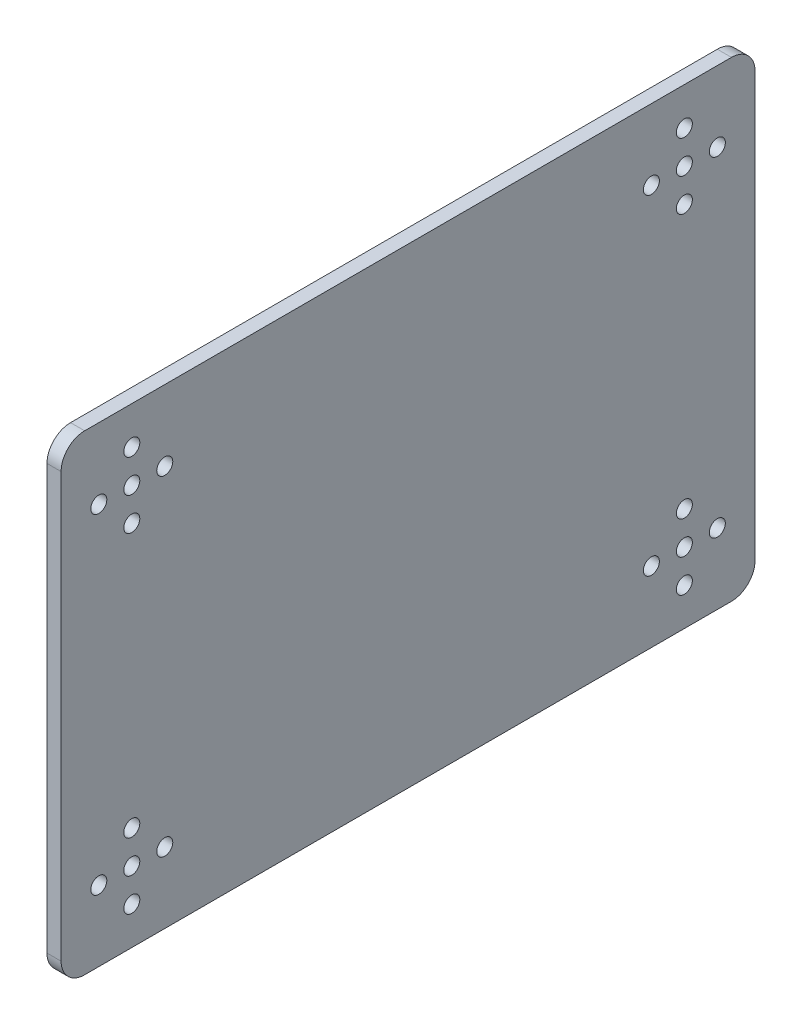
ISO-10303-21;
HEADER;
FILE_DESCRIPTION(('STEP AP214'),'2;1');
FILE_NAME('part.step','',(''),(''),'','','');
FILE_SCHEMA(('AUTOMOTIVE_DESIGN { 1 0 10303 214 1 1 1 1 }'));
ENDSEC;
DATA;
#1=APPLICATION_CONTEXT('core data for automotive mechanical design processes');
#2=APPLICATION_PROTOCOL_DEFINITION('international standard','automotive_design',2000,#1);
#3=PRODUCT_CONTEXT('',#1,'mechanical');
#4=PRODUCT('Part','Part','',(#3));
#5=PRODUCT_RELATED_PRODUCT_CATEGORY('part','',(#4));
#6=PRODUCT_DEFINITION_FORMATION('','',#4);
#7=PRODUCT_DEFINITION_CONTEXT('part definition',#1,'design');
#8=PRODUCT_DEFINITION('design','',#6,#7);
#9=PRODUCT_DEFINITION_SHAPE('','',#8);
#10=(LENGTH_UNIT() NAMED_UNIT(*) SI_UNIT(.MILLI.,.METRE.));
#11=(NAMED_UNIT(*) PLANE_ANGLE_UNIT() SI_UNIT($,.RADIAN.));
#12=(NAMED_UNIT(*) SI_UNIT($,.STERADIAN.) SOLID_ANGLE_UNIT());
#13=UNCERTAINTY_MEASURE_WITH_UNIT(LENGTH_MEASURE(1.E-05),#10,'distance_accuracy_value','');
#14=(GEOMETRIC_REPRESENTATION_CONTEXT(3) GLOBAL_UNCERTAINTY_ASSIGNED_CONTEXT((#13)) GLOBAL_UNIT_ASSIGNED_CONTEXT((#10,
#11,#12)) REPRESENTATION_CONTEXT('',''));
#15=CARTESIAN_POINT('',(0.,0.,0.));
#16=DIRECTION('',(0.,0.,1.));
#17=DIRECTION('',(1.,0.,0.));
#18=AXIS2_PLACEMENT_3D('',#15,#16,#17);
#19=CARTESIAN_POINT('',(3.,0.,0.));
#20=DIRECTION('',(-1.,0.,0.));
#21=DIRECTION('',(0.,0.,1.));
#22=AXIS2_PLACEMENT_3D('',#19,#20,#21);
#23=PLANE('',#22);
#24=CARTESIAN_POINT('',(3.,35.,58.645));
#25=DIRECTION('',(-1.,0.,0.));
#26=DIRECTION('',(0.,0.,1.));
#27=AXIS2_PLACEMENT_3D('',#24,#25,#26);
#28=CIRCLE('',#27,1.69999999999999);
#29=CARTESIAN_POINT('',(3.,35.,60.345));
#30=VERTEX_POINT('',#29);
#31=EDGE_CURVE('E288',#30,#30,#28,.T.);
#32=ORIENTED_EDGE('',*,*,#31,.T.);
#33=EDGE_LOOP('',(#32));
#34=FACE_BOUND('',#33,.T.);
#35=CARTESIAN_POINT('',(3.,42.,58.645));
#36=DIRECTION('',(-1.,0.,0.));
#37=DIRECTION('',(0.,0.,1.));
#38=AXIS2_PLACEMENT_3D('',#35,#36,#37);
#39=CIRCLE('',#38,1.69999999999999);
#40=CARTESIAN_POINT('',(3.,42.,60.345));
#41=VERTEX_POINT('',#40);
#42=EDGE_CURVE('E282',#41,#41,#39,.T.);
#43=ORIENTED_EDGE('',*,*,#42,.T.);
#44=EDGE_LOOP('',(#43));
#45=FACE_BOUND('',#44,.T.);
#46=CARTESIAN_POINT('',(3.,35.,65.645));
#47=DIRECTION('',(-1.,0.,0.));
#48=DIRECTION('',(0.,0.,1.));
#49=AXIS2_PLACEMENT_3D('',#46,#47,#48);
#50=CIRCLE('',#49,1.69999999999999);
#51=CARTESIAN_POINT('',(3.,35.,67.345));
#52=VERTEX_POINT('',#51);
#53=EDGE_CURVE('E276',#52,#52,#50,.T.);
#54=ORIENTED_EDGE('',*,*,#53,.T.);
#55=EDGE_LOOP('',(#54));
#56=FACE_BOUND('',#55,.T.);
#57=CARTESIAN_POINT('',(3.,28.,58.645));
#58=DIRECTION('',(-1.,0.,0.));
#59=DIRECTION('',(0.,0.,1.));
#60=AXIS2_PLACEMENT_3D('',#57,#58,#59);
#61=CIRCLE('',#60,1.69999999999999);
#62=CARTESIAN_POINT('',(3.,28.,60.345));
#63=VERTEX_POINT('',#62);
#64=EDGE_CURVE('E270',#63,#63,#61,.T.);
#65=ORIENTED_EDGE('',*,*,#64,.T.);
#66=EDGE_LOOP('',(#65));
#67=FACE_BOUND('',#66,.T.);
#68=CARTESIAN_POINT('',(3.,35.,51.645));
#69=DIRECTION('',(-1.,0.,0.));
#70=DIRECTION('',(0.,0.,1.));
#71=AXIS2_PLACEMENT_3D('',#68,#69,#70);
#72=CIRCLE('',#71,1.69999999999999);
#73=CARTESIAN_POINT('',(3.,35.,53.345));
#74=VERTEX_POINT('',#73);
#75=EDGE_CURVE('E264',#74,#74,#72,.T.);
#76=ORIENTED_EDGE('',*,*,#75,.T.);
#77=EDGE_LOOP('',(#76));
#78=FACE_BOUND('',#77,.T.);
#79=CARTESIAN_POINT('',(3.,-35.,58.645));
#80=DIRECTION('',(-1.,0.,0.));
#81=DIRECTION('',(0.,0.,1.));
#82=AXIS2_PLACEMENT_3D('',#79,#80,#81);
#83=CIRCLE('',#82,1.69999999999999);
#84=CARTESIAN_POINT('',(3.,-35.,60.345));
#85=VERTEX_POINT('',#84);
#86=EDGE_CURVE('E258',#85,#85,#83,.T.);
#87=ORIENTED_EDGE('',*,*,#86,.T.);
#88=EDGE_LOOP('',(#87));
#89=FACE_BOUND('',#88,.T.);
#90=CARTESIAN_POINT('',(3.,-28.,58.645));
#91=DIRECTION('',(-1.,0.,0.));
#92=DIRECTION('',(0.,0.,1.));
#93=AXIS2_PLACEMENT_3D('',#90,#91,#92);
#94=CIRCLE('',#93,1.69999999999999);
#95=CARTESIAN_POINT('',(3.,-28.,60.345));
#96=VERTEX_POINT('',#95);
#97=EDGE_CURVE('E252',#96,#96,#94,.T.);
#98=ORIENTED_EDGE('',*,*,#97,.T.);
#99=EDGE_LOOP('',(#98));
#100=FACE_BOUND('',#99,.T.);
#101=CARTESIAN_POINT('',(3.,-35.,65.645));
#102=DIRECTION('',(-1.,0.,0.));
#103=DIRECTION('',(0.,0.,1.));
#104=AXIS2_PLACEMENT_3D('',#101,#102,#103);
#105=CIRCLE('',#104,1.69999999999999);
#106=CARTESIAN_POINT('',(3.,-35.,67.345));
#107=VERTEX_POINT('',#106);
#108=EDGE_CURVE('E246',#107,#107,#105,.T.);
#109=ORIENTED_EDGE('',*,*,#108,.T.);
#110=EDGE_LOOP('',(#109));
#111=FACE_BOUND('',#110,.T.);
#112=CARTESIAN_POINT('',(3.,-42.,58.645));
#113=DIRECTION('',(-1.,0.,0.));
#114=DIRECTION('',(0.,0.,1.));
#115=AXIS2_PLACEMENT_3D('',#112,#113,#114);
#116=CIRCLE('',#115,1.69999999999999);
#117=CARTESIAN_POINT('',(3.,-42.,60.345));
#118=VERTEX_POINT('',#117);
#119=EDGE_CURVE('E240',#118,#118,#116,.T.);
#120=ORIENTED_EDGE('',*,*,#119,.T.);
#121=EDGE_LOOP('',(#120));
#122=FACE_BOUND('',#121,.T.);
#123=CARTESIAN_POINT('',(3.,-35.,51.645));
#124=DIRECTION('',(-1.,0.,0.));
#125=DIRECTION('',(0.,0.,1.));
#126=AXIS2_PLACEMENT_3D('',#123,#124,#125);
#127=CIRCLE('',#126,1.69999999999999);
#128=CARTESIAN_POINT('',(3.,-35.,53.345));
#129=VERTEX_POINT('',#128);
#130=EDGE_CURVE('E234',#129,#129,#127,.T.);
#131=ORIENTED_EDGE('',*,*,#130,.T.);
#132=EDGE_LOOP('',(#131));
#133=FACE_BOUND('',#132,.T.);
#134=CARTESIAN_POINT('',(3.,-35.,-58.645));
#135=DIRECTION('',(1.,0.,0.));
#136=DIRECTION('',(0.,0.,-1.));
#137=AXIS2_PLACEMENT_3D('',#134,#135,#136);
#138=CIRCLE('',#137,1.69999999999999);
#139=CARTESIAN_POINT('',(3.,-35.,-60.345));
#140=VERTEX_POINT('',#139);
#141=EDGE_CURVE('E231',#140,#140,#138,.T.);
#142=ORIENTED_EDGE('',*,*,#141,.F.);
#143=EDGE_LOOP('',(#142));
#144=FACE_BOUND('',#143,.T.);
#145=CARTESIAN_POINT('',(3.,-28.,-58.645));
#146=DIRECTION('',(1.,0.,0.));
#147=DIRECTION('',(0.,0.,-1.));
#148=AXIS2_PLACEMENT_3D('',#145,#146,#147);
#149=CIRCLE('',#148,1.69999999999999);
#150=CARTESIAN_POINT('',(3.,-28.,-60.345));
#151=VERTEX_POINT('',#150);
#152=EDGE_CURVE('E219',#151,#151,#149,.T.);
#153=ORIENTED_EDGE('',*,*,#152,.F.);
#154=EDGE_LOOP('',(#153));
#155=FACE_BOUND('',#154,.T.);
#156=CARTESIAN_POINT('',(3.,-35.,-65.645));
#157=DIRECTION('',(1.,0.,0.));
#158=DIRECTION('',(0.,0.,-1.));
#159=AXIS2_PLACEMENT_3D('',#156,#157,#158);
#160=CIRCLE('',#159,1.69999999999999);
#161=CARTESIAN_POINT('',(3.,-35.,-67.345));
#162=VERTEX_POINT('',#161);
#163=EDGE_CURVE('E213',#162,#162,#160,.T.);
#164=ORIENTED_EDGE('',*,*,#163,.F.);
#165=EDGE_LOOP('',(#164));
#166=FACE_BOUND('',#165,.T.);
#167=CARTESIAN_POINT('',(3.,35.,-58.645));
#168=DIRECTION('',(1.,0.,0.));
#169=DIRECTION('',(0.,0.,-1.));
#170=AXIS2_PLACEMENT_3D('',#167,#168,#169);
#171=CIRCLE('',#170,1.69999999999999);
#172=CARTESIAN_POINT('',(3.,35.,-60.345));
#173=VERTEX_POINT('',#172);
#174=EDGE_CURVE('E201',#173,#173,#171,.T.);
#175=ORIENTED_EDGE('',*,*,#174,.F.);
#176=EDGE_LOOP('',(#175));
#177=FACE_BOUND('',#176,.T.);
#178=CARTESIAN_POINT('',(3.,28.,-58.645));
#179=DIRECTION('',(1.,0.,0.));
#180=DIRECTION('',(0.,0.,-1.));
#181=AXIS2_PLACEMENT_3D('',#178,#179,#180);
#182=CIRCLE('',#181,1.69999999999999);
#183=CARTESIAN_POINT('',(3.,28.,-60.345));
#184=VERTEX_POINT('',#183);
#185=EDGE_CURVE('E183',#184,#184,#182,.T.);
#186=ORIENTED_EDGE('',*,*,#185,.F.);
#187=EDGE_LOOP('',(#186));
#188=FACE_BOUND('',#187,.T.);
#189=DIRECTION('',(0.,0.,1.));
#190=VECTOR('',#189,1.);
#191=CARTESIAN_POINT('',(3.,50.,73.645));
#192=LINE('',#191,#190);
#193=CARTESIAN_POINT('',(3.,50.,-68.645));
#194=VERTEX_POINT('',#193);
#195=CARTESIAN_POINT('',(3.,50.,68.645));
#196=VERTEX_POINT('',#195);
#197=EDGE_CURVE('E174',#194,#196,#192,.T.);
#198=ORIENTED_EDGE('',*,*,#197,.T.);
#199=CARTESIAN_POINT('',(3.,45.,68.645));
#200=DIRECTION('',(-1.,0.,0.));
#201=DIRECTION('',(0.,0.,1.));
#202=AXIS2_PLACEMENT_3D('',#199,#200,#201);
#203=CIRCLE('',#202,5.);
#204=CARTESIAN_POINT('',(3.,45.,73.645));
#205=VERTEX_POINT('',#204);
#206=EDGE_CURVE('E151',#196,#205,#203,.F.);
#207=ORIENTED_EDGE('',*,*,#206,.T.);
#208=DIRECTION('',(0.,-1.,0.));
#209=VECTOR('',#208,1.);
#210=CARTESIAN_POINT('',(3.,-50.,73.645));
#211=LINE('',#210,#209);
#212=CARTESIAN_POINT('',(3.,-45.,73.645));
#213=VERTEX_POINT('',#212);
#214=EDGE_CURVE('E122',#205,#213,#211,.T.);
#215=ORIENTED_EDGE('',*,*,#214,.T.);
#216=CARTESIAN_POINT('',(3.,-45.,68.645));
#217=DIRECTION('',(-1.,0.,0.));
#218=DIRECTION('',(0.,0.,1.));
#219=AXIS2_PLACEMENT_3D('',#216,#217,#218);
#220=CIRCLE('',#219,5.);
#221=CARTESIAN_POINT('',(3.,-50.,68.645));
#222=VERTEX_POINT('',#221);
#223=EDGE_CURVE('E59',#213,#222,#220,.F.);
#224=ORIENTED_EDGE('',*,*,#223,.T.);
#225=DIRECTION('',(0.,0.,-1.));
#226=VECTOR('',#225,1.);
#227=CARTESIAN_POINT('',(3.,-50.,73.645));
#228=LINE('',#227,#226);
#229=CARTESIAN_POINT('',(3.,-50.,-68.645));
#230=VERTEX_POINT('',#229);
#231=EDGE_CURVE('E137',#222,#230,#228,.T.);
#232=ORIENTED_EDGE('',*,*,#231,.T.);
#233=CARTESIAN_POINT('',(3.,-45.,-68.645));
#234=DIRECTION('',(-1.,0.,0.));
#235=DIRECTION('',(0.,0.,1.));
#236=AXIS2_PLACEMENT_3D('',#233,#234,#235);
#237=CIRCLE('',#236,5.);
#238=CARTESIAN_POINT('',(3.,-45.,-73.645));
#239=VERTEX_POINT('',#238);
#240=EDGE_CURVE('E146',#230,#239,#237,.F.);
#241=ORIENTED_EDGE('',*,*,#240,.T.);
#242=DIRECTION('',(0.,1.,0.));
#243=VECTOR('',#242,1.);
#244=CARTESIAN_POINT('',(3.,-50.,-73.645));
#245=LINE('',#244,#243);
#246=CARTESIAN_POINT('',(3.,45.,-73.645));
#247=VERTEX_POINT('',#246);
#248=EDGE_CURVE('E131',#239,#247,#245,.T.);
#249=ORIENTED_EDGE('',*,*,#248,.T.);
#250=CARTESIAN_POINT('',(3.,45.,-68.645));
#251=DIRECTION('',(-1.,0.,0.));
#252=DIRECTION('',(0.,0.,1.));
#253=AXIS2_PLACEMENT_3D('',#250,#251,#252);
#254=CIRCLE('',#253,5.);
#255=EDGE_CURVE('E148',#247,#194,#254,.F.);
#256=ORIENTED_EDGE('',*,*,#255,.T.);
#257=EDGE_LOOP('',(#198,#207,#215,#224,#232,#241,#249,#256));
#258=FACE_BOUND('',#257,.T.);
#259=CARTESIAN_POINT('',(3.,35.,-65.645));
#260=DIRECTION('',(1.,0.,0.));
#261=DIRECTION('',(0.,0.,-1.));
#262=AXIS2_PLACEMENT_3D('',#259,#260,#261);
#263=CIRCLE('',#262,1.69999999999999);
#264=CARTESIAN_POINT('',(3.,35.,-67.345));
#265=VERTEX_POINT('',#264);
#266=EDGE_CURVE('E169',#265,#265,#263,.T.);
#267=ORIENTED_EDGE('',*,*,#266,.F.);
#268=EDGE_LOOP('',(#267));
#269=FACE_BOUND('',#268,.T.);
#270=CARTESIAN_POINT('',(3.,35.,-51.645));
#271=DIRECTION('',(1.,0.,0.));
#272=DIRECTION('',(0.,0.,-1.));
#273=AXIS2_PLACEMENT_3D('',#270,#271,#272);
#274=CIRCLE('',#273,1.69999999999999);
#275=CARTESIAN_POINT('',(3.,35.,-53.345));
#276=VERTEX_POINT('',#275);
#277=EDGE_CURVE('E189',#276,#276,#274,.T.);
#278=ORIENTED_EDGE('',*,*,#277,.F.);
#279=EDGE_LOOP('',(#278));
#280=FACE_BOUND('',#279,.T.);
#281=CARTESIAN_POINT('',(3.,42.,-58.645));
#282=DIRECTION('',(1.,0.,0.));
#283=DIRECTION('',(0.,0.,-1.));
#284=AXIS2_PLACEMENT_3D('',#281,#282,#283);
#285=CIRCLE('',#284,1.69999999999999);
#286=CARTESIAN_POINT('',(3.,42.,-60.345));
#287=VERTEX_POINT('',#286);
#288=EDGE_CURVE('E195',#287,#287,#285,.T.);
#289=ORIENTED_EDGE('',*,*,#288,.F.);
#290=EDGE_LOOP('',(#289));
#291=FACE_BOUND('',#290,.T.);
#292=CARTESIAN_POINT('',(3.,-42.,-58.645));
#293=DIRECTION('',(1.,0.,0.));
#294=DIRECTION('',(0.,0.,-1.));
#295=AXIS2_PLACEMENT_3D('',#292,#293,#294);
#296=CIRCLE('',#295,1.69999999999999);
#297=CARTESIAN_POINT('',(3.,-42.,-60.345));
#298=VERTEX_POINT('',#297);
#299=EDGE_CURVE('E207',#298,#298,#296,.T.);
#300=ORIENTED_EDGE('',*,*,#299,.F.);
#301=EDGE_LOOP('',(#300));
#302=FACE_BOUND('',#301,.T.);
#303=CARTESIAN_POINT('',(3.,-35.,-51.645));
#304=DIRECTION('',(1.,0.,0.));
#305=DIRECTION('',(0.,0.,-1.));
#306=AXIS2_PLACEMENT_3D('',#303,#304,#305);
#307=CIRCLE('',#306,1.69999999999999);
#308=CARTESIAN_POINT('',(3.,-35.,-53.345));
#309=VERTEX_POINT('',#308);
#310=EDGE_CURVE('E225',#309,#309,#307,.T.);
#311=ORIENTED_EDGE('',*,*,#310,.F.);
#312=EDGE_LOOP('',(#311));
#313=FACE_BOUND('',#312,.T.);
#314=ADVANCED_FACE('F37',(#34,#45,#56,#67,#78,#89,#100,#111,#122,#133,#144,#155,#166,#177,#188,
#258,#269,#280,#291,#302,#313),#23,.F.);
#315=CARTESIAN_POINT('',(3.,-50.,-73.645));
#316=DIRECTION('',(0.,0.,1.));
#317=DIRECTION('',(1.,0.,0.));
#318=AXIS2_PLACEMENT_3D('',#315,#316,#317);
#319=PLANE('',#318);
#320=DIRECTION('',(0.,1.,0.));
#321=VECTOR('',#320,1.);
#322=CARTESIAN_POINT('',(0.,-50.,-73.645));
#323=LINE('',#322,#321);
#324=CARTESIAN_POINT('',(0.,-45.,-73.645));
#325=VERTEX_POINT('',#324);
#326=CARTESIAN_POINT('',(0.,45.,-73.645));
#327=VERTEX_POINT('',#326);
#328=EDGE_CURVE('E133',#325,#327,#323,.T.);
#329=ORIENTED_EDGE('',*,*,#328,.T.);
#330=DIRECTION('',(-1.,0.,0.));
#331=VECTOR('',#330,1.);
#332=CARTESIAN_POINT('',(3.,45.,-73.645));
#333=LINE('',#332,#331);
#334=EDGE_CURVE('E11',#327,#247,#333,.F.);
#335=ORIENTED_EDGE('',*,*,#334,.T.);
#336=ORIENTED_EDGE('',*,*,#248,.F.);
#337=DIRECTION('',(-1.,0.,0.));
#338=VECTOR('',#337,1.);
#339=CARTESIAN_POINT('',(3.,-45.,-73.645));
#340=LINE('',#339,#338);
#341=EDGE_CURVE('E45',#239,#325,#340,.T.);
#342=ORIENTED_EDGE('',*,*,#341,.T.);
#343=EDGE_LOOP('',(#329,#335,#336,#342));
#344=FACE_BOUND('',#343,.T.);
#345=ADVANCED_FACE('F162',(#344),#319,.F.);
#346=CARTESIAN_POINT('',(3.,50.,73.645));
#347=DIRECTION('',(0.,-1.,0.));
#348=DIRECTION('',(0.,0.,-1.));
#349=AXIS2_PLACEMENT_3D('',#346,#347,#348);
#350=PLANE('',#349);
#351=DIRECTION('',(0.,0.,1.));
#352=VECTOR('',#351,1.);
#353=CARTESIAN_POINT('',(0.,50.,73.645));
#354=LINE('',#353,#352);
#355=CARTESIAN_POINT('',(0.,50.,-68.645));
#356=VERTEX_POINT('',#355);
#357=CARTESIAN_POINT('',(0.,50.,68.645));
#358=VERTEX_POINT('',#357);
#359=EDGE_CURVE('E129',#356,#358,#354,.T.);
#360=ORIENTED_EDGE('',*,*,#359,.T.);
#361=DIRECTION('',(-1.,0.,0.));
#362=VECTOR('',#361,1.);
#363=CARTESIAN_POINT('',(3.,50.,68.645));
#364=LINE('',#363,#362);
#365=EDGE_CURVE('E108',#358,#196,#364,.F.);
#366=ORIENTED_EDGE('',*,*,#365,.T.);
#367=ORIENTED_EDGE('',*,*,#197,.F.);
#368=DIRECTION('',(-1.,0.,0.));
#369=VECTOR('',#368,1.);
#370=CARTESIAN_POINT('',(3.,50.,-68.645));
#371=LINE('',#370,#369);
#372=EDGE_CURVE('E113',#194,#356,#371,.T.);
#373=ORIENTED_EDGE('',*,*,#372,.T.);
#374=EDGE_LOOP('',(#360,#366,#367,#373));
#375=FACE_BOUND('',#374,.T.);
#376=ADVANCED_FACE('F358',(#375),#350,.F.);
#377=CARTESIAN_POINT('',(3.,-50.,73.645));
#378=DIRECTION('',(0.,0.,-1.));
#379=DIRECTION('',(-1.,0.,0.));
#380=AXIS2_PLACEMENT_3D('',#377,#378,#379);
#381=PLANE('',#380);
#382=ORIENTED_EDGE('',*,*,#214,.F.);
#383=DIRECTION('',(-1.,0.,0.));
#384=VECTOR('',#383,1.);
#385=CARTESIAN_POINT('',(3.,45.,73.645));
#386=LINE('',#385,#384);
#387=CARTESIAN_POINT('',(0.,45.,73.645));
#388=VERTEX_POINT('',#387);
#389=EDGE_CURVE('E107',#205,#388,#386,.T.);
#390=ORIENTED_EDGE('',*,*,#389,.T.);
#391=DIRECTION('',(0.,-1.,0.));
#392=VECTOR('',#391,1.);
#393=CARTESIAN_POINT('',(0.,-50.,73.645));
#394=LINE('',#393,#392);
#395=CARTESIAN_POINT('',(0.,-45.,73.645));
#396=VERTEX_POINT('',#395);
#397=EDGE_CURVE('E120',#388,#396,#394,.T.);
#398=ORIENTED_EDGE('',*,*,#397,.T.);
#399=DIRECTION('',(-1.,0.,0.));
#400=VECTOR('',#399,1.);
#401=CARTESIAN_POINT('',(3.,-45.,73.645));
#402=LINE('',#401,#400);
#403=EDGE_CURVE('E124',#396,#213,#402,.F.);
#404=ORIENTED_EDGE('',*,*,#403,.T.);
#405=EDGE_LOOP('',(#382,#390,#398,#404));
#406=FACE_BOUND('',#405,.T.);
#407=ADVANCED_FACE('F119',(#406),#381,.F.);
#408=CARTESIAN_POINT('',(3.,-50.,73.645));
#409=DIRECTION('',(0.,1.,0.));
#410=DIRECTION('',(0.,0.,1.));
#411=AXIS2_PLACEMENT_3D('',#408,#409,#410);
#412=PLANE('',#411);
#413=ORIENTED_EDGE('',*,*,#231,.F.);
#414=DIRECTION('',(-1.,0.,0.));
#415=VECTOR('',#414,1.);
#416=CARTESIAN_POINT('',(3.,-50.,68.645));
#417=LINE('',#416,#415);
#418=CARTESIAN_POINT('',(0.,-50.,68.645));
#419=VERTEX_POINT('',#418);
#420=EDGE_CURVE('E154',#222,#419,#417,.T.);
#421=ORIENTED_EDGE('',*,*,#420,.T.);
#422=DIRECTION('',(0.,0.,-1.));
#423=VECTOR('',#422,1.);
#424=CARTESIAN_POINT('',(0.,-50.,73.645));
#425=LINE('',#424,#423);
#426=CARTESIAN_POINT('',(0.,-50.,-68.645));
#427=VERTEX_POINT('',#426);
#428=EDGE_CURVE('E128',#419,#427,#425,.T.);
#429=ORIENTED_EDGE('',*,*,#428,.T.);
#430=DIRECTION('',(-1.,0.,0.));
#431=VECTOR('',#430,1.);
#432=CARTESIAN_POINT('',(3.,-50.,-68.645));
#433=LINE('',#432,#431);
#434=EDGE_CURVE('E52',#427,#230,#433,.F.);
#435=ORIENTED_EDGE('',*,*,#434,.T.);
#436=EDGE_LOOP('',(#413,#421,#429,#435));
#437=FACE_BOUND('',#436,.T.);
#438=ADVANCED_FACE('F300',(#437),#412,.F.);
#439=CARTESIAN_POINT('',(0.,0.,0.));
#440=DIRECTION('',(-1.,0.,0.));
#441=DIRECTION('',(0.,0.,1.));
#442=AXIS2_PLACEMENT_3D('',#439,#440,#441);
#443=PLANE('',#442);
#444=CARTESIAN_POINT('',(0.,35.,58.645));
#445=DIRECTION('',(-1.,0.,0.));
#446=DIRECTION('',(0.,0.,1.));
#447=AXIS2_PLACEMENT_3D('',#444,#445,#446);
#448=CIRCLE('',#447,1.69999999999999);
#449=CARTESIAN_POINT('',(0.,35.,60.345));
#450=VERTEX_POINT('',#449);
#451=EDGE_CURVE('E291',#450,#450,#448,.T.);
#452=ORIENTED_EDGE('',*,*,#451,.F.);
#453=EDGE_LOOP('',(#452));
#454=FACE_BOUND('',#453,.T.);
#455=CARTESIAN_POINT('',(0.,42.,58.645));
#456=DIRECTION('',(-1.,0.,0.));
#457=DIRECTION('',(0.,0.,1.));
#458=AXIS2_PLACEMENT_3D('',#455,#456,#457);
#459=CIRCLE('',#458,1.69999999999999);
#460=CARTESIAN_POINT('',(0.,42.,60.345));
#461=VERTEX_POINT('',#460);
#462=EDGE_CURVE('E285',#461,#461,#459,.T.);
#463=ORIENTED_EDGE('',*,*,#462,.F.);
#464=EDGE_LOOP('',(#463));
#465=FACE_BOUND('',#464,.T.);
#466=CARTESIAN_POINT('',(0.,35.,65.645));
#467=DIRECTION('',(-1.,0.,0.));
#468=DIRECTION('',(0.,0.,1.));
#469=AXIS2_PLACEMENT_3D('',#466,#467,#468);
#470=CIRCLE('',#469,1.69999999999999);
#471=CARTESIAN_POINT('',(0.,35.,67.345));
#472=VERTEX_POINT('',#471);
#473=EDGE_CURVE('E279',#472,#472,#470,.T.);
#474=ORIENTED_EDGE('',*,*,#473,.F.);
#475=EDGE_LOOP('',(#474));
#476=FACE_BOUND('',#475,.T.);
#477=CARTESIAN_POINT('',(0.,28.,58.645));
#478=DIRECTION('',(-1.,0.,0.));
#479=DIRECTION('',(0.,0.,1.));
#480=AXIS2_PLACEMENT_3D('',#477,#478,#479);
#481=CIRCLE('',#480,1.69999999999999);
#482=CARTESIAN_POINT('',(0.,28.,60.345));
#483=VERTEX_POINT('',#482);
#484=EDGE_CURVE('E273',#483,#483,#481,.T.);
#485=ORIENTED_EDGE('',*,*,#484,.F.);
#486=EDGE_LOOP('',(#485));
#487=FACE_BOUND('',#486,.T.);
#488=CARTESIAN_POINT('',(0.,35.,51.645));
#489=DIRECTION('',(-1.,0.,0.));
#490=DIRECTION('',(0.,0.,1.));
#491=AXIS2_PLACEMENT_3D('',#488,#489,#490);
#492=CIRCLE('',#491,1.69999999999999);
#493=CARTESIAN_POINT('',(0.,35.,53.345));
#494=VERTEX_POINT('',#493);
#495=EDGE_CURVE('E267',#494,#494,#492,.T.);
#496=ORIENTED_EDGE('',*,*,#495,.F.);
#497=EDGE_LOOP('',(#496));
#498=FACE_BOUND('',#497,.T.);
#499=CARTESIAN_POINT('',(0.,-35.,58.645));
#500=DIRECTION('',(-1.,0.,0.));
#501=DIRECTION('',(0.,0.,1.));
#502=AXIS2_PLACEMENT_3D('',#499,#500,#501);
#503=CIRCLE('',#502,1.69999999999999);
#504=CARTESIAN_POINT('',(0.,-35.,60.345));
#505=VERTEX_POINT('',#504);
#506=EDGE_CURVE('E261',#505,#505,#503,.T.);
#507=ORIENTED_EDGE('',*,*,#506,.F.);
#508=EDGE_LOOP('',(#507));
#509=FACE_BOUND('',#508,.T.);
#510=CARTESIAN_POINT('',(0.,-28.,58.645));
#511=DIRECTION('',(-1.,0.,0.));
#512=DIRECTION('',(0.,0.,1.));
#513=AXIS2_PLACEMENT_3D('',#510,#511,#512);
#514=CIRCLE('',#513,1.69999999999999);
#515=CARTESIAN_POINT('',(0.,-28.,60.345));
#516=VERTEX_POINT('',#515);
#517=EDGE_CURVE('E255',#516,#516,#514,.T.);
#518=ORIENTED_EDGE('',*,*,#517,.F.);
#519=EDGE_LOOP('',(#518));
#520=FACE_BOUND('',#519,.T.);
#521=CARTESIAN_POINT('',(0.,-35.,65.645));
#522=DIRECTION('',(-1.,0.,0.));
#523=DIRECTION('',(0.,0.,1.));
#524=AXIS2_PLACEMENT_3D('',#521,#522,#523);
#525=CIRCLE('',#524,1.69999999999999);
#526=CARTESIAN_POINT('',(0.,-35.,67.345));
#527=VERTEX_POINT('',#526);
#528=EDGE_CURVE('E249',#527,#527,#525,.T.);
#529=ORIENTED_EDGE('',*,*,#528,.F.);
#530=EDGE_LOOP('',(#529));
#531=FACE_BOUND('',#530,.T.);
#532=CARTESIAN_POINT('',(0.,-42.,58.645));
#533=DIRECTION('',(-1.,0.,0.));
#534=DIRECTION('',(0.,0.,1.));
#535=AXIS2_PLACEMENT_3D('',#532,#533,#534);
#536=CIRCLE('',#535,1.69999999999999);
#537=CARTESIAN_POINT('',(0.,-42.,60.345));
#538=VERTEX_POINT('',#537);
#539=EDGE_CURVE('E243',#538,#538,#536,.T.);
#540=ORIENTED_EDGE('',*,*,#539,.F.);
#541=EDGE_LOOP('',(#540));
#542=FACE_BOUND('',#541,.T.);
#543=CARTESIAN_POINT('',(0.,-35.,51.645));
#544=DIRECTION('',(-1.,0.,0.));
#545=DIRECTION('',(0.,0.,1.));
#546=AXIS2_PLACEMENT_3D('',#543,#544,#545);
#547=CIRCLE('',#546,1.69999999999999);
#548=CARTESIAN_POINT('',(0.,-35.,53.345));
#549=VERTEX_POINT('',#548);
#550=EDGE_CURVE('E237',#549,#549,#547,.T.);
#551=ORIENTED_EDGE('',*,*,#550,.F.);
#552=EDGE_LOOP('',(#551));
#553=FACE_BOUND('',#552,.T.);
#554=CARTESIAN_POINT('',(0.,-35.,-58.645));
#555=DIRECTION('',(-1.,0.,0.));
#556=DIRECTION('',(0.,0.,1.));
#557=AXIS2_PLACEMENT_3D('',#554,#555,#556);
#558=CIRCLE('',#557,1.69999999999999);
#559=CARTESIAN_POINT('',(0.,-35.,-56.945));
#560=VERTEX_POINT('',#559);
#561=EDGE_CURVE('E228',#560,#560,#558,.T.);
#562=ORIENTED_EDGE('',*,*,#561,.F.);
#563=EDGE_LOOP('',(#562));
#564=FACE_BOUND('',#563,.T.);
#565=CARTESIAN_POINT('',(0.,-35.,-51.645));
#566=DIRECTION('',(-1.,0.,0.));
#567=DIRECTION('',(0.,0.,1.));
#568=AXIS2_PLACEMENT_3D('',#565,#566,#567);
#569=CIRCLE('',#568,1.69999999999999);
#570=CARTESIAN_POINT('',(0.,-35.,-49.945));
#571=VERTEX_POINT('',#570);
#572=EDGE_CURVE('E222',#571,#571,#569,.T.);
#573=ORIENTED_EDGE('',*,*,#572,.F.);
#574=EDGE_LOOP('',(#573));
#575=FACE_BOUND('',#574,.T.);
#576=CARTESIAN_POINT('',(0.,-28.,-58.645));
#577=DIRECTION('',(-1.,0.,0.));
#578=DIRECTION('',(0.,0.,1.));
#579=AXIS2_PLACEMENT_3D('',#576,#577,#578);
#580=CIRCLE('',#579,1.69999999999999);
#581=CARTESIAN_POINT('',(0.,-28.,-56.945));
#582=VERTEX_POINT('',#581);
#583=EDGE_CURVE('E216',#582,#582,#580,.T.);
#584=ORIENTED_EDGE('',*,*,#583,.F.);
#585=EDGE_LOOP('',(#584));
#586=FACE_BOUND('',#585,.T.);
#587=CARTESIAN_POINT('',(0.,-35.,-65.645));
#588=DIRECTION('',(-1.,0.,0.));
#589=DIRECTION('',(0.,0.,1.));
#590=AXIS2_PLACEMENT_3D('',#587,#588,#589);
#591=CIRCLE('',#590,1.69999999999999);
#592=CARTESIAN_POINT('',(0.,-35.,-63.945));
#593=VERTEX_POINT('',#592);
#594=EDGE_CURVE('E210',#593,#593,#591,.T.);
#595=ORIENTED_EDGE('',*,*,#594,.F.);
#596=EDGE_LOOP('',(#595));
#597=FACE_BOUND('',#596,.T.);
#598=CARTESIAN_POINT('',(0.,-42.,-58.645));
#599=DIRECTION('',(-1.,0.,0.));
#600=DIRECTION('',(0.,0.,1.));
#601=AXIS2_PLACEMENT_3D('',#598,#599,#600);
#602=CIRCLE('',#601,1.69999999999999);
#603=CARTESIAN_POINT('',(0.,-42.,-56.945));
#604=VERTEX_POINT('',#603);
#605=EDGE_CURVE('E204',#604,#604,#602,.T.);
#606=ORIENTED_EDGE('',*,*,#605,.F.);
#607=EDGE_LOOP('',(#606));
#608=FACE_BOUND('',#607,.T.);
#609=CARTESIAN_POINT('',(0.,35.,-58.645));
#610=DIRECTION('',(-1.,0.,0.));
#611=DIRECTION('',(0.,0.,1.));
#612=AXIS2_PLACEMENT_3D('',#609,#610,#611);
#613=CIRCLE('',#612,1.69999999999999);
#614=CARTESIAN_POINT('',(0.,35.,-56.945));
#615=VERTEX_POINT('',#614);
#616=EDGE_CURVE('E198',#615,#615,#613,.T.);
#617=ORIENTED_EDGE('',*,*,#616,.F.);
#618=EDGE_LOOP('',(#617));
#619=FACE_BOUND('',#618,.T.);
#620=CARTESIAN_POINT('',(0.,42.,-58.645));
#621=DIRECTION('',(-1.,0.,0.));
#622=DIRECTION('',(0.,0.,1.));
#623=AXIS2_PLACEMENT_3D('',#620,#621,#622);
#624=CIRCLE('',#623,1.69999999999999);
#625=CARTESIAN_POINT('',(0.,42.,-56.945));
#626=VERTEX_POINT('',#625);
#627=EDGE_CURVE('E192',#626,#626,#624,.T.);
#628=ORIENTED_EDGE('',*,*,#627,.F.);
#629=EDGE_LOOP('',(#628));
#630=FACE_BOUND('',#629,.T.);
#631=CARTESIAN_POINT('',(0.,35.,-51.645));
#632=DIRECTION('',(-1.,0.,0.));
#633=DIRECTION('',(0.,0.,1.));
#634=AXIS2_PLACEMENT_3D('',#631,#632,#633);
#635=CIRCLE('',#634,1.69999999999999);
#636=CARTESIAN_POINT('',(0.,35.,-49.945));
#637=VERTEX_POINT('',#636);
#638=EDGE_CURVE('E186',#637,#637,#635,.T.);
#639=ORIENTED_EDGE('',*,*,#638,.F.);
#640=EDGE_LOOP('',(#639));
#641=FACE_BOUND('',#640,.T.);
#642=CARTESIAN_POINT('',(0.,28.,-58.645));
#643=DIRECTION('',(-1.,0.,0.));
#644=DIRECTION('',(0.,0.,1.));
#645=AXIS2_PLACEMENT_3D('',#642,#643,#644);
#646=CIRCLE('',#645,1.69999999999999);
#647=CARTESIAN_POINT('',(0.,28.,-56.945));
#648=VERTEX_POINT('',#647);
#649=EDGE_CURVE('E180',#648,#648,#646,.T.);
#650=ORIENTED_EDGE('',*,*,#649,.F.);
#651=EDGE_LOOP('',(#650));
#652=FACE_BOUND('',#651,.T.);
#653=CARTESIAN_POINT('',(0.,35.,-65.645));
#654=DIRECTION('',(-1.,0.,0.));
#655=DIRECTION('',(0.,0.,1.));
#656=AXIS2_PLACEMENT_3D('',#653,#654,#655);
#657=CIRCLE('',#656,1.69999999999999);
#658=CARTESIAN_POINT('',(0.,35.,-63.945));
#659=VERTEX_POINT('',#658);
#660=EDGE_CURVE('E167',#659,#659,#657,.T.);
#661=ORIENTED_EDGE('',*,*,#660,.F.);
#662=EDGE_LOOP('',(#661));
#663=FACE_BOUND('',#662,.T.);
#664=ORIENTED_EDGE('',*,*,#397,.F.);
#665=CARTESIAN_POINT('',(0.,45.,68.645));
#666=DIRECTION('',(-1.,0.,0.));
#667=DIRECTION('',(0.,0.,1.));
#668=AXIS2_PLACEMENT_3D('',#665,#666,#667);
#669=CIRCLE('',#668,5.);
#670=EDGE_CURVE('E103',#388,#358,#669,.T.);
#671=ORIENTED_EDGE('',*,*,#670,.T.);
#672=ORIENTED_EDGE('',*,*,#359,.F.);
#673=CARTESIAN_POINT('',(0.,45.,-68.645));
#674=DIRECTION('',(-1.,0.,0.));
#675=DIRECTION('',(0.,0.,1.));
#676=AXIS2_PLACEMENT_3D('',#673,#674,#675);
#677=CIRCLE('',#676,5.);
#678=EDGE_CURVE('E140',#356,#327,#677,.T.);
#679=ORIENTED_EDGE('',*,*,#678,.T.);
#680=ORIENTED_EDGE('',*,*,#328,.F.);
#681=CARTESIAN_POINT('',(0.,-45.,-68.645));
#682=DIRECTION('',(-1.,0.,0.));
#683=DIRECTION('',(0.,0.,1.));
#684=AXIS2_PLACEMENT_3D('',#681,#682,#683);
#685=CIRCLE('',#684,5.);
#686=EDGE_CURVE('E123',#325,#427,#685,.T.);
#687=ORIENTED_EDGE('',*,*,#686,.T.);
#688=ORIENTED_EDGE('',*,*,#428,.F.);
#689=CARTESIAN_POINT('',(0.,-45.,68.645));
#690=DIRECTION('',(-1.,0.,0.));
#691=DIRECTION('',(0.,0.,1.));
#692=AXIS2_PLACEMENT_3D('',#689,#690,#691);
#693=CIRCLE('',#692,5.);
#694=EDGE_CURVE('E114',#419,#396,#693,.T.);
#695=ORIENTED_EDGE('',*,*,#694,.T.);
#696=EDGE_LOOP('',(#664,#671,#672,#679,#680,#687,#688,#695));
#697=FACE_BOUND('',#696,.T.);
#698=ADVANCED_FACE('F126',(#454,#465,#476,#487,#498,#509,#520,#531,#542,#553,#564,#575,#586,
#597,#608,#619,#630,#641,#652,#663,#697),#443,.T.);
#699=CARTESIAN_POINT('',(3.,35.,-65.645));
#700=DIRECTION('',(1.,0.,0.));
#701=DIRECTION('',(0.,0.,-1.));
#702=AXIS2_PLACEMENT_3D('',#699,#700,#701);
#703=CYLINDRICAL_SURFACE('',#702,1.69999999999999);
#704=ORIENTED_EDGE('',*,*,#266,.T.);
#705=EDGE_LOOP('',(#704));
#706=FACE_BOUND('',#705,.T.);
#707=ORIENTED_EDGE('',*,*,#660,.T.);
#708=EDGE_LOOP('',(#707));
#709=FACE_BOUND('',#708,.T.);
#710=ADVANCED_FACE('F299',(#706,#709),#703,.F.);
#711=CARTESIAN_POINT('',(3.,28.,-58.645));
#712=DIRECTION('',(1.,0.,0.));
#713=DIRECTION('',(0.,0.,-1.));
#714=AXIS2_PLACEMENT_3D('',#711,#712,#713);
#715=CYLINDRICAL_SURFACE('',#714,1.69999999999999);
#716=ORIENTED_EDGE('',*,*,#185,.T.);
#717=EDGE_LOOP('',(#716));
#718=FACE_BOUND('',#717,.T.);
#719=ORIENTED_EDGE('',*,*,#649,.T.);
#720=EDGE_LOOP('',(#719));
#721=FACE_BOUND('',#720,.T.);
#722=ADVANCED_FACE('F341',(#718,#721),#715,.F.);
#723=CARTESIAN_POINT('',(3.,35.,-51.645));
#724=DIRECTION('',(1.,0.,0.));
#725=DIRECTION('',(0.,0.,-1.));
#726=AXIS2_PLACEMENT_3D('',#723,#724,#725);
#727=CYLINDRICAL_SURFACE('',#726,1.69999999999999);
#728=ORIENTED_EDGE('',*,*,#277,.T.);
#729=EDGE_LOOP('',(#728));
#730=FACE_BOUND('',#729,.T.);
#731=ORIENTED_EDGE('',*,*,#638,.T.);
#732=EDGE_LOOP('',(#731));
#733=FACE_BOUND('',#732,.T.);
#734=ADVANCED_FACE('F348',(#730,#733),#727,.F.);
#735=CARTESIAN_POINT('',(3.,42.,-58.645));
#736=DIRECTION('',(1.,0.,0.));
#737=DIRECTION('',(0.,0.,-1.));
#738=AXIS2_PLACEMENT_3D('',#735,#736,#737);
#739=CYLINDRICAL_SURFACE('',#738,1.69999999999999);
#740=ORIENTED_EDGE('',*,*,#288,.T.);
#741=EDGE_LOOP('',(#740));
#742=FACE_BOUND('',#741,.T.);
#743=ORIENTED_EDGE('',*,*,#627,.T.);
#744=EDGE_LOOP('',(#743));
#745=FACE_BOUND('',#744,.T.);
#746=ADVANCED_FACE('F423',(#742,#745),#739,.F.);
#747=CARTESIAN_POINT('',(3.,35.,-58.645));
#748=DIRECTION('',(1.,0.,0.));
#749=DIRECTION('',(0.,0.,-1.));
#750=AXIS2_PLACEMENT_3D('',#747,#748,#749);
#751=CYLINDRICAL_SURFACE('',#750,1.69999999999999);
#752=ORIENTED_EDGE('',*,*,#174,.T.);
#753=EDGE_LOOP('',(#752));
#754=FACE_BOUND('',#753,.T.);
#755=ORIENTED_EDGE('',*,*,#616,.T.);
#756=EDGE_LOOP('',(#755));
#757=FACE_BOUND('',#756,.T.);
#758=ADVANCED_FACE('F419',(#754,#757),#751,.F.);
#759=CARTESIAN_POINT('',(3.,-42.,-58.645));
#760=DIRECTION('',(1.,0.,0.));
#761=DIRECTION('',(0.,0.,-1.));
#762=AXIS2_PLACEMENT_3D('',#759,#760,#761);
#763=CYLINDRICAL_SURFACE('',#762,1.69999999999999);
#764=ORIENTED_EDGE('',*,*,#299,.T.);
#765=EDGE_LOOP('',(#764));
#766=FACE_BOUND('',#765,.T.);
#767=ORIENTED_EDGE('',*,*,#605,.T.);
#768=EDGE_LOOP('',(#767));
#769=FACE_BOUND('',#768,.T.);
#770=ADVANCED_FACE('F415',(#766,#769),#763,.F.);
#771=CARTESIAN_POINT('',(3.,-35.,-65.645));
#772=DIRECTION('',(1.,0.,0.));
#773=DIRECTION('',(0.,0.,-1.));
#774=AXIS2_PLACEMENT_3D('',#771,#772,#773);
#775=CYLINDRICAL_SURFACE('',#774,1.69999999999999);
#776=ORIENTED_EDGE('',*,*,#163,.T.);
#777=EDGE_LOOP('',(#776));
#778=FACE_BOUND('',#777,.T.);
#779=ORIENTED_EDGE('',*,*,#594,.T.);
#780=EDGE_LOOP('',(#779));
#781=FACE_BOUND('',#780,.T.);
#782=ADVANCED_FACE('F408',(#778,#781),#775,.F.);
#783=CARTESIAN_POINT('',(3.,-28.,-58.645));
#784=DIRECTION('',(1.,0.,0.));
#785=DIRECTION('',(0.,0.,-1.));
#786=AXIS2_PLACEMENT_3D('',#783,#784,#785);
#787=CYLINDRICAL_SURFACE('',#786,1.69999999999999);
#788=ORIENTED_EDGE('',*,*,#152,.T.);
#789=EDGE_LOOP('',(#788));
#790=FACE_BOUND('',#789,.T.);
#791=ORIENTED_EDGE('',*,*,#583,.T.);
#792=EDGE_LOOP('',(#791));
#793=FACE_BOUND('',#792,.T.);
#794=ADVANCED_FACE('F399',(#790,#793),#787,.F.);
#795=CARTESIAN_POINT('',(3.,-35.,-51.645));
#796=DIRECTION('',(1.,0.,0.));
#797=DIRECTION('',(0.,0.,-1.));
#798=AXIS2_PLACEMENT_3D('',#795,#796,#797);
#799=CYLINDRICAL_SURFACE('',#798,1.69999999999999);
#800=ORIENTED_EDGE('',*,*,#310,.T.);
#801=EDGE_LOOP('',(#800));
#802=FACE_BOUND('',#801,.T.);
#803=ORIENTED_EDGE('',*,*,#572,.T.);
#804=EDGE_LOOP('',(#803));
#805=FACE_BOUND('',#804,.T.);
#806=ADVANCED_FACE('F395',(#802,#805),#799,.F.);
#807=CARTESIAN_POINT('',(3.,-35.,-58.645));
#808=DIRECTION('',(1.,0.,0.));
#809=DIRECTION('',(0.,0.,-1.));
#810=AXIS2_PLACEMENT_3D('',#807,#808,#809);
#811=CYLINDRICAL_SURFACE('',#810,1.69999999999999);
#812=ORIENTED_EDGE('',*,*,#141,.T.);
#813=EDGE_LOOP('',(#812));
#814=FACE_BOUND('',#813,.T.);
#815=ORIENTED_EDGE('',*,*,#561,.T.);
#816=EDGE_LOOP('',(#815));
#817=FACE_BOUND('',#816,.T.);
#818=ADVANCED_FACE('F398',(#814,#817),#811,.F.);
#819=CARTESIAN_POINT('',(0.,-35.,51.645));
#820=DIRECTION('',(-1.,0.,0.));
#821=DIRECTION('',(0.,0.,1.));
#822=AXIS2_PLACEMENT_3D('',#819,#820,#821);
#823=CYLINDRICAL_SURFACE('',#822,1.69999999999999);
#824=ORIENTED_EDGE('',*,*,#130,.F.);
#825=EDGE_LOOP('',(#824));
#826=FACE_BOUND('',#825,.T.);
#827=ORIENTED_EDGE('',*,*,#550,.T.);
#828=EDGE_LOOP('',(#827));
#829=FACE_BOUND('',#828,.T.);
#830=ADVANCED_FACE('F405',(#826,#829),#823,.F.);
#831=CARTESIAN_POINT('',(0.,-42.,58.645));
#832=DIRECTION('',(-1.,0.,0.));
#833=DIRECTION('',(0.,0.,1.));
#834=AXIS2_PLACEMENT_3D('',#831,#832,#833);
#835=CYLINDRICAL_SURFACE('',#834,1.69999999999999);
#836=ORIENTED_EDGE('',*,*,#119,.F.);
#837=EDGE_LOOP('',(#836));
#838=FACE_BOUND('',#837,.T.);
#839=ORIENTED_EDGE('',*,*,#539,.T.);
#840=EDGE_LOOP('',(#839));
#841=FACE_BOUND('',#840,.T.);
#842=ADVANCED_FACE('F474',(#838,#841),#835,.F.);
#843=CARTESIAN_POINT('',(0.,-35.,65.645));
#844=DIRECTION('',(-1.,0.,0.));
#845=DIRECTION('',(0.,0.,1.));
#846=AXIS2_PLACEMENT_3D('',#843,#844,#845);
#847=CYLINDRICAL_SURFACE('',#846,1.69999999999999);
#848=ORIENTED_EDGE('',*,*,#108,.F.);
#849=EDGE_LOOP('',(#848));
#850=FACE_BOUND('',#849,.T.);
#851=ORIENTED_EDGE('',*,*,#528,.T.);
#852=EDGE_LOOP('',(#851));
#853=FACE_BOUND('',#852,.T.);
#854=ADVANCED_FACE('F483',(#850,#853),#847,.F.);
#855=CARTESIAN_POINT('',(0.,-28.,58.645));
#856=DIRECTION('',(-1.,0.,0.));
#857=DIRECTION('',(0.,0.,1.));
#858=AXIS2_PLACEMENT_3D('',#855,#856,#857);
#859=CYLINDRICAL_SURFACE('',#858,1.69999999999999);
#860=ORIENTED_EDGE('',*,*,#97,.F.);
#861=EDGE_LOOP('',(#860));
#862=FACE_BOUND('',#861,.T.);
#863=ORIENTED_EDGE('',*,*,#517,.T.);
#864=EDGE_LOOP('',(#863));
#865=FACE_BOUND('',#864,.T.);
#866=ADVANCED_FACE('F493',(#862,#865),#859,.F.);
#867=CARTESIAN_POINT('',(0.,-35.,58.645));
#868=DIRECTION('',(-1.,0.,0.));
#869=DIRECTION('',(0.,0.,1.));
#870=AXIS2_PLACEMENT_3D('',#867,#868,#869);
#871=CYLINDRICAL_SURFACE('',#870,1.69999999999999);
#872=ORIENTED_EDGE('',*,*,#86,.F.);
#873=EDGE_LOOP('',(#872));
#874=FACE_BOUND('',#873,.T.);
#875=ORIENTED_EDGE('',*,*,#506,.T.);
#876=EDGE_LOOP('',(#875));
#877=FACE_BOUND('',#876,.T.);
#878=ADVANCED_FACE('F503',(#874,#877),#871,.F.);
#879=CARTESIAN_POINT('',(0.,35.,51.645));
#880=DIRECTION('',(-1.,0.,0.));
#881=DIRECTION('',(0.,0.,1.));
#882=AXIS2_PLACEMENT_3D('',#879,#880,#881);
#883=CYLINDRICAL_SURFACE('',#882,1.69999999999999);
#884=ORIENTED_EDGE('',*,*,#75,.F.);
#885=EDGE_LOOP('',(#884));
#886=FACE_BOUND('',#885,.T.);
#887=ORIENTED_EDGE('',*,*,#495,.T.);
#888=EDGE_LOOP('',(#887));
#889=FACE_BOUND('',#888,.T.);
#890=ADVANCED_FACE('F513',(#886,#889),#883,.F.);
#891=CARTESIAN_POINT('',(0.,28.,58.645));
#892=DIRECTION('',(-1.,0.,0.));
#893=DIRECTION('',(0.,0.,1.));
#894=AXIS2_PLACEMENT_3D('',#891,#892,#893);
#895=CYLINDRICAL_SURFACE('',#894,1.69999999999999);
#896=ORIENTED_EDGE('',*,*,#64,.F.);
#897=EDGE_LOOP('',(#896));
#898=FACE_BOUND('',#897,.T.);
#899=ORIENTED_EDGE('',*,*,#484,.T.);
#900=EDGE_LOOP('',(#899));
#901=FACE_BOUND('',#900,.T.);
#902=ADVANCED_FACE('F523',(#898,#901),#895,.F.);
#903=CARTESIAN_POINT('',(0.,35.,65.645));
#904=DIRECTION('',(-1.,0.,0.));
#905=DIRECTION('',(0.,0.,1.));
#906=AXIS2_PLACEMENT_3D('',#903,#904,#905);
#907=CYLINDRICAL_SURFACE('',#906,1.69999999999999);
#908=ORIENTED_EDGE('',*,*,#53,.F.);
#909=EDGE_LOOP('',(#908));
#910=FACE_BOUND('',#909,.T.);
#911=ORIENTED_EDGE('',*,*,#473,.T.);
#912=EDGE_LOOP('',(#911));
#913=FACE_BOUND('',#912,.T.);
#914=ADVANCED_FACE('F533',(#910,#913),#907,.F.);
#915=CARTESIAN_POINT('',(0.,42.,58.645));
#916=DIRECTION('',(-1.,0.,0.));
#917=DIRECTION('',(0.,0.,1.));
#918=AXIS2_PLACEMENT_3D('',#915,#916,#917);
#919=CYLINDRICAL_SURFACE('',#918,1.69999999999999);
#920=ORIENTED_EDGE('',*,*,#42,.F.);
#921=EDGE_LOOP('',(#920));
#922=FACE_BOUND('',#921,.T.);
#923=ORIENTED_EDGE('',*,*,#462,.T.);
#924=EDGE_LOOP('',(#923));
#925=FACE_BOUND('',#924,.T.);
#926=ADVANCED_FACE('F543',(#922,#925),#919,.F.);
#927=CARTESIAN_POINT('',(0.,35.,58.645));
#928=DIRECTION('',(-1.,0.,0.));
#929=DIRECTION('',(0.,0.,1.));
#930=AXIS2_PLACEMENT_3D('',#927,#928,#929);
#931=CYLINDRICAL_SURFACE('',#930,1.69999999999999);
#932=ORIENTED_EDGE('',*,*,#31,.F.);
#933=EDGE_LOOP('',(#932));
#934=FACE_BOUND('',#933,.T.);
#935=ORIENTED_EDGE('',*,*,#451,.T.);
#936=EDGE_LOOP('',(#935));
#937=FACE_BOUND('',#936,.T.);
#938=ADVANCED_FACE('F295',(#934,#937),#931,.F.);
#939=CARTESIAN_POINT('',(3.,45.,68.645));
#940=DIRECTION('',(-1.,0.,0.));
#941=DIRECTION('',(0.,0.,1.));
#942=AXIS2_PLACEMENT_3D('',#939,#940,#941);
#943=CYLINDRICAL_SURFACE('',#942,5.);
#944=ORIENTED_EDGE('',*,*,#206,.F.);
#945=ORIENTED_EDGE('',*,*,#365,.F.);
#946=ORIENTED_EDGE('',*,*,#670,.F.);
#947=ORIENTED_EDGE('',*,*,#389,.F.);
#948=EDGE_LOOP('',(#944,#945,#946,#947));
#949=FACE_BOUND('',#948,.T.);
#950=ADVANCED_FACE('F106',(#949),#943,.T.);
#951=CARTESIAN_POINT('',(3.,-45.,68.645));
#952=DIRECTION('',(-1.,0.,0.));
#953=DIRECTION('',(0.,0.,1.));
#954=AXIS2_PLACEMENT_3D('',#951,#952,#953);
#955=CYLINDRICAL_SURFACE('',#954,5.);
#956=ORIENTED_EDGE('',*,*,#223,.F.);
#957=ORIENTED_EDGE('',*,*,#403,.F.);
#958=ORIENTED_EDGE('',*,*,#694,.F.);
#959=ORIENTED_EDGE('',*,*,#420,.F.);
#960=EDGE_LOOP('',(#956,#957,#958,#959));
#961=FACE_BOUND('',#960,.T.);
#962=ADVANCED_FACE('F371',(#961),#955,.T.);
#963=CARTESIAN_POINT('',(3.,45.,-68.645));
#964=DIRECTION('',(-1.,0.,0.));
#965=DIRECTION('',(0.,0.,1.));
#966=AXIS2_PLACEMENT_3D('',#963,#964,#965);
#967=CYLINDRICAL_SURFACE('',#966,5.);
#968=ORIENTED_EDGE('',*,*,#255,.F.);
#969=ORIENTED_EDGE('',*,*,#334,.F.);
#970=ORIENTED_EDGE('',*,*,#678,.F.);
#971=ORIENTED_EDGE('',*,*,#372,.F.);
#972=EDGE_LOOP('',(#968,#969,#970,#971));
#973=FACE_BOUND('',#972,.T.);
#974=ADVANCED_FACE('F373',(#973),#967,.T.);
#975=CARTESIAN_POINT('',(3.,-45.,-68.645));
#976=DIRECTION('',(-1.,0.,0.));
#977=DIRECTION('',(0.,0.,1.));
#978=AXIS2_PLACEMENT_3D('',#975,#976,#977);
#979=CYLINDRICAL_SURFACE('',#978,5.);
#980=ORIENTED_EDGE('',*,*,#240,.F.);
#981=ORIENTED_EDGE('',*,*,#434,.F.);
#982=ORIENTED_EDGE('',*,*,#686,.F.);
#983=ORIENTED_EDGE('',*,*,#341,.F.);
#984=EDGE_LOOP('',(#980,#981,#982,#983));
#985=FACE_BOUND('',#984,.T.);
#986=ADVANCED_FACE('F39',(#985),#979,.T.);
#987=CLOSED_SHELL('',(#314,#345,#376,#407,#438,#698,#710,#722,#734,#746,#758,#770,#782,#794,
#806,#818,#830,#842,#854,#866,#878,#890,#902,#914,#926,#938,#950,#962,#974,#986));
#988=MANIFOLD_SOLID_BREP('B2',#987);
#989=ADVANCED_BREP_SHAPE_REPRESENTATION('',(#18,#988),#14);
#990=SHAPE_DEFINITION_REPRESENTATION(#9,#989);
ENDSEC;
END-ISO-10303-21;
